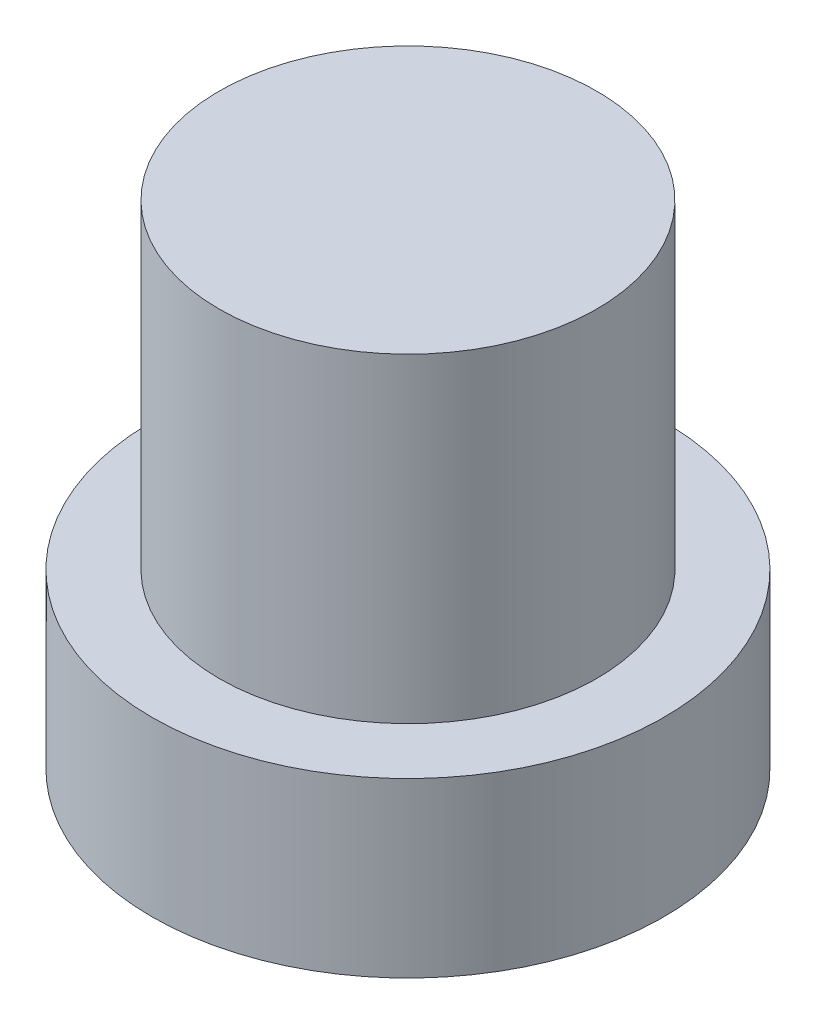
ISO-10303-21;
HEADER;
FILE_DESCRIPTION(('STEP AP214'),'2;1');
FILE_NAME('part.step','',(''),(''),'','','');
FILE_SCHEMA(('AUTOMOTIVE_DESIGN { 1 0 10303 214 1 1 1 1 }'));
ENDSEC;
DATA;
#1=APPLICATION_CONTEXT('core data for automotive mechanical design processes');
#2=APPLICATION_PROTOCOL_DEFINITION('international standard','automotive_design',2000,#1);
#3=PRODUCT_CONTEXT('',#1,'mechanical');
#4=PRODUCT('Part','Part','',(#3));
#5=PRODUCT_RELATED_PRODUCT_CATEGORY('part','',(#4));
#6=PRODUCT_DEFINITION_FORMATION('','',#4);
#7=PRODUCT_DEFINITION_CONTEXT('part definition',#1,'design');
#8=PRODUCT_DEFINITION('design','',#6,#7);
#9=PRODUCT_DEFINITION_SHAPE('','',#8);
#10=(LENGTH_UNIT() NAMED_UNIT(*) SI_UNIT(.MILLI.,.METRE.));
#11=(NAMED_UNIT(*) PLANE_ANGLE_UNIT() SI_UNIT($,.RADIAN.));
#12=(NAMED_UNIT(*) SI_UNIT($,.STERADIAN.) SOLID_ANGLE_UNIT());
#13=UNCERTAINTY_MEASURE_WITH_UNIT(LENGTH_MEASURE(1.E-05),#10,'distance_accuracy_value','');
#14=(GEOMETRIC_REPRESENTATION_CONTEXT(3) GLOBAL_UNCERTAINTY_ASSIGNED_CONTEXT((#13)) GLOBAL_UNIT_ASSIGNED_CONTEXT((#10,
#11,#12)) REPRESENTATION_CONTEXT('',''));
#15=CARTESIAN_POINT('',(0.,0.,0.));
#16=DIRECTION('',(0.,0.,1.));
#17=DIRECTION('',(1.,0.,0.));
#18=AXIS2_PLACEMENT_3D('',#15,#16,#17);
#19=CARTESIAN_POINT('',(0.,0.,0.));
#20=DIRECTION('',(0.,1.,0.));
#21=DIRECTION('',(0.,0.,1.));
#22=AXIS2_PLACEMENT_3D('',#19,#20,#21);
#23=PLANE('',#22);
#24=CARTESIAN_POINT('',(0.,0.,0.));
#25=DIRECTION('',(0.,1.,0.));
#26=DIRECTION('',(0.,0.,1.));
#27=AXIS2_PLACEMENT_3D('',#24,#25,#26);
#28=CIRCLE('',#27,4.);
#29=CARTESIAN_POINT('',(0.,0.,4.));
#30=VERTEX_POINT('',#29);
#31=EDGE_CURVE('E45',#30,#30,#28,.T.);
#32=ORIENTED_EDGE('',*,*,#31,.F.);
#33=EDGE_LOOP('',(#32));
#34=FACE_BOUND('',#33,.T.);
#35=CARTESIAN_POINT('',(0.,0.,0.));
#36=DIRECTION('',(0.,1.,0.));
#37=DIRECTION('',(0.,0.,1.));
#38=AXIS2_PLACEMENT_3D('',#35,#36,#37);
#39=CIRCLE('',#38,3.);
#40=CARTESIAN_POINT('',(0.,0.,3.));
#41=VERTEX_POINT('',#40);
#42=EDGE_CURVE('E55',#41,#41,#39,.T.);
#43=ORIENTED_EDGE('',*,*,#42,.T.);
#44=EDGE_LOOP('',(#43));
#45=FACE_BOUND('',#44,.T.);
#46=ADVANCED_FACE('F41',(#34,#45),#23,.F.);
#47=CARTESIAN_POINT('',(0.,2.4,0.));
#48=DIRECTION('',(0.,-1.,0.));
#49=DIRECTION('',(0.,0.,-1.));
#50=AXIS2_PLACEMENT_3D('',#47,#48,#49);
#51=CYLINDRICAL_SURFACE('',#50,4.);
#52=ORIENTED_EDGE('',*,*,#31,.T.);
#53=EDGE_LOOP('',(#52));
#54=FACE_BOUND('',#53,.T.);
#55=CARTESIAN_POINT('',(0.,2.7,0.));
#56=DIRECTION('',(0.,1.,0.));
#57=DIRECTION('',(0.,0.,1.));
#58=AXIS2_PLACEMENT_3D('',#55,#56,#57);
#59=CIRCLE('',#58,4.);
#60=CARTESIAN_POINT('',(0.,2.7,4.));
#61=VERTEX_POINT('',#60);
#62=EDGE_CURVE('E59',#61,#61,#59,.T.);
#63=ORIENTED_EDGE('',*,*,#62,.F.);
#64=EDGE_LOOP('',(#63));
#65=FACE_BOUND('',#64,.T.);
#66=ADVANCED_FACE('F43',(#54,#65),#51,.T.);
#67=CARTESIAN_POINT('',(0.,2.4,0.));
#68=DIRECTION('',(0.,-1.,0.));
#69=DIRECTION('',(0.,0.,-1.));
#70=AXIS2_PLACEMENT_3D('',#67,#68,#69);
#71=CYLINDRICAL_SURFACE('',#70,3.);
#72=CARTESIAN_POINT('',(0.,2.4,0.));
#73=DIRECTION('',(0.,1.,0.));
#74=DIRECTION('',(0.,0.,1.));
#75=AXIS2_PLACEMENT_3D('',#72,#73,#74);
#76=CIRCLE('',#75,3.);
#77=CARTESIAN_POINT('',(0.,2.4,3.));
#78=VERTEX_POINT('',#77);
#79=EDGE_CURVE('E63',#78,#78,#76,.T.);
#80=ORIENTED_EDGE('',*,*,#79,.T.);
#81=EDGE_LOOP('',(#80));
#82=FACE_BOUND('',#81,.T.);
#83=ORIENTED_EDGE('',*,*,#42,.F.);
#84=EDGE_LOOP('',(#83));
#85=FACE_BOUND('',#84,.T.);
#86=ADVANCED_FACE('F71',(#82,#85),#71,.F.);
#87=CARTESIAN_POINT('',(0.,2.4,0.));
#88=DIRECTION('',(0.,1.,0.));
#89=DIRECTION('',(0.,0.,1.));
#90=AXIS2_PLACEMENT_3D('',#87,#88,#89);
#91=PLANE('',#90);
#92=ORIENTED_EDGE('',*,*,#79,.F.);
#93=EDGE_LOOP('',(#92));
#94=FACE_BOUND('',#93,.T.);
#95=ADVANCED_FACE('F73',(#94),#91,.F.);
#96=CARTESIAN_POINT('',(0.,2.7,0.));
#97=DIRECTION('',(0.,1.,0.));
#98=DIRECTION('',(0.,0.,1.));
#99=AXIS2_PLACEMENT_3D('',#96,#97,#98);
#100=PLANE('',#99);
#101=CARTESIAN_POINT('',(0.,2.7,0.));
#102=DIRECTION('',(0.,1.,0.));
#103=DIRECTION('',(0.,0.,1.));
#104=AXIS2_PLACEMENT_3D('',#101,#102,#103);
#105=CIRCLE('',#104,2.95);
#106=CARTESIAN_POINT('',(0.,2.7,2.95));
#107=VERTEX_POINT('',#106);
#108=EDGE_CURVE('E10',#107,#107,#105,.T.);
#109=ORIENTED_EDGE('',*,*,#108,.F.);
#110=EDGE_LOOP('',(#109));
#111=FACE_BOUND('',#110,.T.);
#112=ORIENTED_EDGE('',*,*,#62,.T.);
#113=EDGE_LOOP('',(#112));
#114=FACE_BOUND('',#113,.T.);
#115=ADVANCED_FACE('F80',(#111,#114),#100,.T.);
#116=CARTESIAN_POINT('',(0.,7.7,0.));
#117=DIRECTION('',(0.,-1.,0.));
#118=DIRECTION('',(0.,0.,-1.));
#119=AXIS2_PLACEMENT_3D('',#116,#117,#118);
#120=CYLINDRICAL_SURFACE('',#119,2.95);
#121=CARTESIAN_POINT('',(0.,7.7,0.));
#122=DIRECTION('',(0.,1.,0.));
#123=DIRECTION('',(0.,0.,1.));
#124=AXIS2_PLACEMENT_3D('',#121,#122,#123);
#125=CIRCLE('',#124,2.95);
#126=CARTESIAN_POINT('',(0.,7.7,2.95));
#127=VERTEX_POINT('',#126);
#128=EDGE_CURVE('E58',#127,#127,#125,.T.);
#129=ORIENTED_EDGE('',*,*,#128,.F.);
#130=EDGE_LOOP('',(#129));
#131=FACE_BOUND('',#130,.T.);
#132=ORIENTED_EDGE('',*,*,#108,.T.);
#133=EDGE_LOOP('',(#132));
#134=FACE_BOUND('',#133,.T.);
#135=ADVANCED_FACE('F93',(#131,#134),#120,.T.);
#136=CARTESIAN_POINT('',(0.,7.7,0.));
#137=DIRECTION('',(0.,1.,0.));
#138=DIRECTION('',(0.,0.,1.));
#139=AXIS2_PLACEMENT_3D('',#136,#137,#138);
#140=PLANE('',#139);
#141=ORIENTED_EDGE('',*,*,#128,.T.);
#142=EDGE_LOOP('',(#141));
#143=FACE_BOUND('',#142,.T.);
#144=ADVANCED_FACE('F99',(#143),#140,.T.);
#145=CLOSED_SHELL('',(#46,#66,#86,#95,#115,#135,#144));
#146=MANIFOLD_SOLID_BREP('B2',#145);
#147=ADVANCED_BREP_SHAPE_REPRESENTATION('',(#18,#146),#14);
#148=SHAPE_DEFINITION_REPRESENTATION(#9,#147);
ENDSEC;
END-ISO-10303-21;
